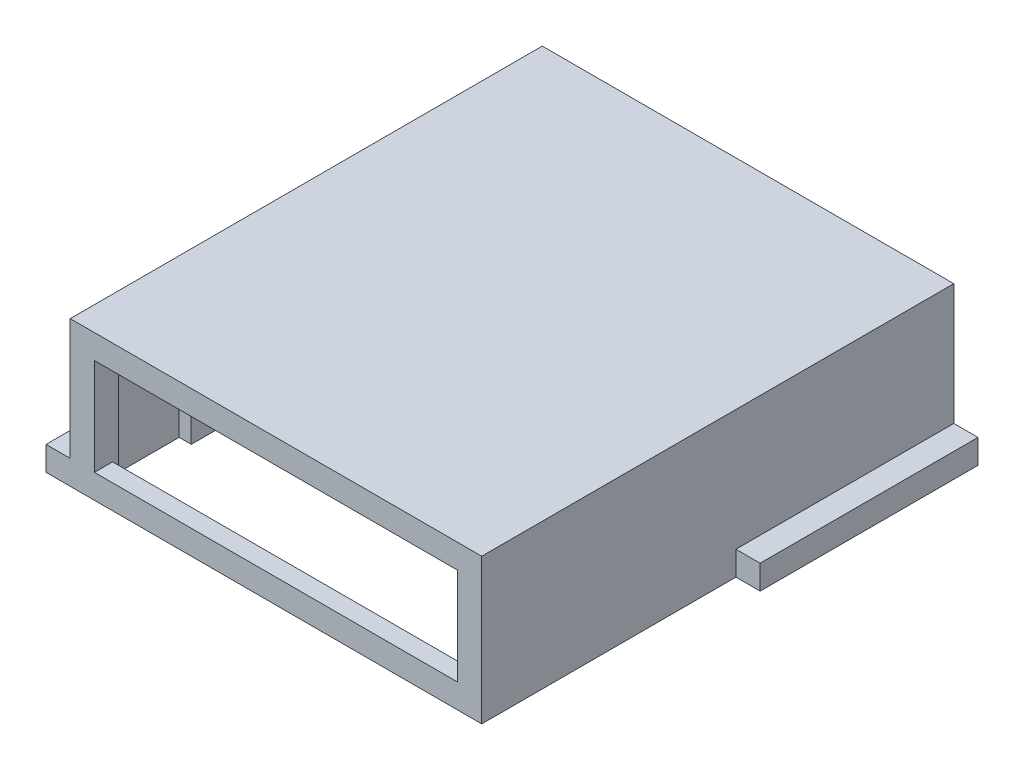
ISO-10303-21;
HEADER;
FILE_DESCRIPTION(('STEP AP214'),'2;1');
FILE_NAME('part.step','',(''),(''),'','','');
FILE_SCHEMA(('AUTOMOTIVE_DESIGN { 1 0 10303 214 1 1 1 1 }'));
ENDSEC;
DATA;
#1=APPLICATION_CONTEXT('core data for automotive mechanical design processes');
#2=APPLICATION_PROTOCOL_DEFINITION('international standard','automotive_design',2000,#1);
#3=PRODUCT_CONTEXT('',#1,'mechanical');
#4=PRODUCT('Part','Part','',(#3));
#5=PRODUCT_RELATED_PRODUCT_CATEGORY('part','',(#4));
#6=PRODUCT_DEFINITION_FORMATION('','',#4);
#7=PRODUCT_DEFINITION_CONTEXT('part definition',#1,'design');
#8=PRODUCT_DEFINITION('design','',#6,#7);
#9=PRODUCT_DEFINITION_SHAPE('','',#8);
#10=(LENGTH_UNIT() NAMED_UNIT(*) SI_UNIT(.MILLI.,.METRE.));
#11=(NAMED_UNIT(*) PLANE_ANGLE_UNIT() SI_UNIT($,.RADIAN.));
#12=(NAMED_UNIT(*) SI_UNIT($,.STERADIAN.) SOLID_ANGLE_UNIT());
#13=UNCERTAINTY_MEASURE_WITH_UNIT(LENGTH_MEASURE(1.E-05),#10,'distance_accuracy_value','');
#14=(GEOMETRIC_REPRESENTATION_CONTEXT(3) GLOBAL_UNCERTAINTY_ASSIGNED_CONTEXT((#13)) GLOBAL_UNIT_ASSIGNED_CONTEXT((#10,
#11,#12)) REPRESENTATION_CONTEXT('',''));
#15=CARTESIAN_POINT('',(0.,0.,0.));
#16=DIRECTION('',(0.,0.,1.));
#17=DIRECTION('',(1.,0.,0.));
#18=AXIS2_PLACEMENT_3D('',#15,#16,#17);
#19=CARTESIAN_POINT('',(0.,0.,0.));
#20=DIRECTION('',(0.,1.,0.));
#21=DIRECTION('',(0.,0.,1.));
#22=AXIS2_PLACEMENT_3D('',#19,#20,#21);
#23=PLANE('',#22);
#24=DIRECTION('',(0.,0.,1.));
#25=VECTOR('',#24,1.);
#26=CARTESIAN_POINT('',(-5.68181818181819,0.,-8.18181818181818));
#27=LINE('',#26,#25);
#28=CARTESIAN_POINT('',(-5.68181818181819,0.,-8.18181818181818));
#29=VERTEX_POINT('',#28);
#30=CARTESIAN_POINT('',(-5.68181818181819,0.,2.31818181818182));
#31=VERTEX_POINT('',#30);
#32=EDGE_CURVE('E436',#29,#31,#27,.T.);
#33=ORIENTED_EDGE('',*,*,#32,.F.);
#34=DIRECTION('',(-1.,0.,0.));
#35=VECTOR('',#34,1.);
#36=CARTESIAN_POINT('',(-5.68181818181819,0.,-8.18181818181818));
#37=LINE('',#36,#35);
#38=CARTESIAN_POINT('',(12.3181818181818,0.,-8.18181818181818));
#39=VERTEX_POINT('',#38);
#40=EDGE_CURVE('E441',#39,#29,#37,.T.);
#41=ORIENTED_EDGE('',*,*,#40,.F.);
#42=DIRECTION('',(0.,0.,-1.));
#43=VECTOR('',#42,1.);
#44=CARTESIAN_POINT('',(12.3181818181818,0.,0.818181818181823));
#45=LINE('',#44,#43);
#46=CARTESIAN_POINT('',(12.3181818181818,0.,0.818181818181823));
#47=VERTEX_POINT('',#46);
#48=EDGE_CURVE('E380',#47,#39,#45,.T.);
#49=ORIENTED_EDGE('',*,*,#48,.F.);
#50=DIRECTION('',(-1.,0.,0.));
#51=VECTOR('',#50,1.);
#52=CARTESIAN_POINT('',(12.3181818181818,0.,0.818181818181823));
#53=LINE('',#52,#51);
#54=CARTESIAN_POINT('',(11.3181818181818,0.,0.818181818181824));
#55=VERTEX_POINT('',#54);
#56=EDGE_CURVE('E398',#47,#55,#53,.T.);
#57=ORIENTED_EDGE('',*,*,#56,.T.);
#58=DIRECTION('',(0.,0.,-1.));
#59=VECTOR('',#58,1.);
#60=CARTESIAN_POINT('',(11.3181818181818,0.,-8.18181818181818));
#61=LINE('',#60,#59);
#62=CARTESIAN_POINT('',(11.3181818181818,0.,11.3181818181818));
#63=VERTEX_POINT('',#62);
#64=EDGE_CURVE('E451',#63,#55,#61,.T.);
#65=ORIENTED_EDGE('',*,*,#64,.F.);
#66=DIRECTION('',(1.,0.,0.));
#67=VECTOR('',#66,1.);
#68=CARTESIAN_POINT('',(-5.68181818181819,0.,11.3181818181818));
#69=LINE('',#68,#67);
#70=CARTESIAN_POINT('',(-6.68181818181819,0.,11.3181818181818));
#71=VERTEX_POINT('',#70);
#72=EDGE_CURVE('E449',#71,#63,#69,.T.);
#73=ORIENTED_EDGE('',*,*,#72,.F.);
#74=DIRECTION('',(0.,0.,1.));
#75=VECTOR('',#74,1.);
#76=CARTESIAN_POINT('',(-6.68181818181819,0.,2.31818181818182));
#77=LINE('',#76,#75);
#78=CARTESIAN_POINT('',(-6.68181818181819,0.,2.31818181818182));
#79=VERTEX_POINT('',#78);
#80=EDGE_CURVE('E355',#79,#71,#77,.T.);
#81=ORIENTED_EDGE('',*,*,#80,.F.);
#82=DIRECTION('',(1.,0.,0.));
#83=VECTOR('',#82,1.);
#84=CARTESIAN_POINT('',(-6.68181818181819,0.,2.31818181818182));
#85=LINE('',#84,#83);
#86=EDGE_CURVE('E373',#79,#31,#85,.T.);
#87=ORIENTED_EDGE('',*,*,#86,.T.);
#88=EDGE_LOOP('',(#33,#41,#49,#57,#65,#73,#81,#87));
#89=FACE_BOUND('',#88,.T.);
#90=DIRECTION('',(1.,0.,0.));
#91=VECTOR('',#90,1.);
#92=CARTESIAN_POINT('',(-5.18181818181819,0.,-3.43181818181818));
#93=LINE('',#92,#91);
#94=CARTESIAN_POINT('',(-5.18181818181819,0.,-3.43181818181818));
#95=VERTEX_POINT('',#94);
#96=CARTESIAN_POINT('',(-4.68181818181819,0.,-3.43181818181818));
#97=VERTEX_POINT('',#96);
#98=EDGE_CURVE('E274',#95,#97,#93,.T.);
#99=ORIENTED_EDGE('',*,*,#98,.T.);
#100=DIRECTION('',(0.,0.,1.));
#101=VECTOR('',#100,1.);
#102=CARTESIAN_POINT('',(-4.68181818181819,0.,-7.43181818181818));
#103=LINE('',#102,#101);
#104=CARTESIAN_POINT('',(-4.68181818181819,0.,7.31818181818182));
#105=VERTEX_POINT('',#104);
#106=EDGE_CURVE('E420',#97,#105,#103,.T.);
#107=ORIENTED_EDGE('',*,*,#106,.T.);
#108=DIRECTION('',(-1.,0.,0.));
#109=VECTOR('',#108,1.);
#110=CARTESIAN_POINT('',(-5.18181818181818,0.,7.31818181818182));
#111=LINE('',#110,#109);
#112=CARTESIAN_POINT('',(-5.18181818181818,0.,7.31818181818182));
#113=VERTEX_POINT('',#112);
#114=EDGE_CURVE('E299',#105,#113,#111,.T.);
#115=ORIENTED_EDGE('',*,*,#114,.T.);
#116=DIRECTION('',(0.,0.,1.));
#117=VECTOR('',#116,1.);
#118=CARTESIAN_POINT('',(-5.18181818181818,0.,10.3181818181818));
#119=LINE('',#118,#117);
#120=CARTESIAN_POINT('',(-5.18181818181818,0.,10.3181818181818));
#121=VERTEX_POINT('',#120);
#122=EDGE_CURVE('E306',#113,#121,#119,.T.);
#123=ORIENTED_EDGE('',*,*,#122,.T.);
#124=DIRECTION('',(1.,0.,0.));
#125=VECTOR('',#124,1.);
#126=CARTESIAN_POINT('',(-5.18181818181818,0.,10.3181818181818));
#127=LINE('',#126,#125);
#128=CARTESIAN_POINT('',(-4.68181818181819,0.,10.3181818181818));
#129=VERTEX_POINT('',#128);
#130=EDGE_CURVE('E303',#121,#129,#127,.T.);
#131=ORIENTED_EDGE('',*,*,#130,.T.);
#132=CARTESIAN_POINT('',(-4.68181818181819,0.,10.5681818181818));
#133=VERTEX_POINT('',#132);
#134=EDGE_CURVE('E418',#129,#133,#103,.T.);
#135=ORIENTED_EDGE('',*,*,#134,.T.);
#136=DIRECTION('',(1.,0.,0.));
#137=VECTOR('',#136,1.);
#138=CARTESIAN_POINT('',(-4.68181818181819,0.,10.5681818181818));
#139=LINE('',#138,#137);
#140=CARTESIAN_POINT('',(10.3181818181818,0.,10.5681818181818));
#141=VERTEX_POINT('',#140);
#142=EDGE_CURVE('E406',#133,#141,#139,.T.);
#143=ORIENTED_EDGE('',*,*,#142,.T.);
#144=DIRECTION('',(0.,0.,-1.));
#145=VECTOR('',#144,1.);
#146=CARTESIAN_POINT('',(10.3181818181818,0.,-7.43181818181818));
#147=LINE('',#146,#145);
#148=CARTESIAN_POINT('',(10.3181818181818,0.,10.3181818181818));
#149=VERTEX_POINT('',#148);
#150=EDGE_CURVE('E413',#141,#149,#147,.T.);
#151=ORIENTED_EDGE('',*,*,#150,.T.);
#152=CARTESIAN_POINT('',(10.8181818181818,0.,10.3181818181818));
#153=VERTEX_POINT('',#152);
#154=EDGE_CURVE('E302',#149,#153,#127,.T.);
#155=ORIENTED_EDGE('',*,*,#154,.T.);
#156=DIRECTION('',(0.,0.,-1.));
#157=VECTOR('',#156,1.);
#158=CARTESIAN_POINT('',(10.8181818181818,0.,10.3181818181818));
#159=LINE('',#158,#157);
#160=CARTESIAN_POINT('',(10.8181818181818,0.,7.31818181818182));
#161=VERTEX_POINT('',#160);
#162=EDGE_CURVE('E298',#153,#161,#159,.T.);
#163=ORIENTED_EDGE('',*,*,#162,.T.);
#164=CARTESIAN_POINT('',(10.3181818181818,0.,7.31818181818182));
#165=VERTEX_POINT('',#164);
#166=EDGE_CURVE('E295',#161,#165,#111,.T.);
#167=ORIENTED_EDGE('',*,*,#166,.T.);
#168=CARTESIAN_POINT('',(10.3181818181818,0.,-3.43181818181818));
#169=VERTEX_POINT('',#168);
#170=EDGE_CURVE('E401',#165,#169,#147,.T.);
#171=ORIENTED_EDGE('',*,*,#170,.T.);
#172=CARTESIAN_POINT('',(10.8181818181818,0.,-3.43181818181818));
#173=VERTEX_POINT('',#172);
#174=EDGE_CURVE('E498',#169,#173,#93,.T.);
#175=ORIENTED_EDGE('',*,*,#174,.T.);
#176=DIRECTION('',(0.,0.,-1.));
#177=VECTOR('',#176,1.);
#178=CARTESIAN_POINT('',(10.8181818181818,0.,-7.43181818181818));
#179=LINE('',#178,#177);
#180=CARTESIAN_POINT('',(10.8181818181818,0.,-7.43181818181818));
#181=VERTEX_POINT('',#180);
#182=EDGE_CURVE('E270',#173,#181,#179,.T.);
#183=ORIENTED_EDGE('',*,*,#182,.T.);
#184=DIRECTION('',(-1.,0.,0.));
#185=VECTOR('',#184,1.);
#186=CARTESIAN_POINT('',(-4.68181818181819,0.,-7.43181818181818));
#187=LINE('',#186,#185);
#188=CARTESIAN_POINT('',(-5.18181818181819,0.,-7.43181818181818));
#189=VERTEX_POINT('',#188);
#190=EDGE_CURVE('E416',#181,#189,#187,.T.);
#191=ORIENTED_EDGE('',*,*,#190,.T.);
#192=DIRECTION('',(0.,0.,1.));
#193=VECTOR('',#192,1.);
#194=CARTESIAN_POINT('',(-5.18181818181819,0.,-7.43181818181818));
#195=LINE('',#194,#193);
#196=EDGE_CURVE('E309',#189,#95,#195,.T.);
#197=ORIENTED_EDGE('',*,*,#196,.T.);
#198=EDGE_LOOP('',(#99,#107,#115,#123,#131,#135,#143,#151,#155,#163,#167,#171,#175,#183,#191,#197));
#199=FACE_BOUND('',#198,.T.);
#200=ADVANCED_FACE('F43',(#89,#199),#23,.F.);
#201=CARTESIAN_POINT('',(10.3181818181818,5.2,-7.43181818181818));
#202=DIRECTION('',(-1.,0.,0.));
#203=DIRECTION('',(0.,0.,1.));
#204=AXIS2_PLACEMENT_3D('',#201,#202,#203);
#205=PLANE('',#204);
#206=DIRECTION('',(0.,0.,-1.));
#207=VECTOR('',#206,1.);
#208=CARTESIAN_POINT('',(10.3181818181818,4.,-7.43181818181818));
#209=LINE('',#208,#207);
#210=CARTESIAN_POINT('',(10.3181818181818,4.,-3.43181818181818));
#211=VERTEX_POINT('',#210);
#212=CARTESIAN_POINT('',(10.3181818181818,4.,-7.43181818181818));
#213=VERTEX_POINT('',#212);
#214=EDGE_CURVE('E326',#211,#213,#209,.T.);
#215=ORIENTED_EDGE('',*,*,#214,.F.);
#216=DIRECTION('',(0.,-1.,0.));
#217=VECTOR('',#216,1.);
#218=CARTESIAN_POINT('',(10.3181818181818,5.2,-3.43181818181818));
#219=LINE('',#218,#217);
#220=EDGE_CURVE('E328',#211,#169,#219,.T.);
#221=ORIENTED_EDGE('',*,*,#220,.T.);
#222=ORIENTED_EDGE('',*,*,#170,.F.);
#223=DIRECTION('',(0.,1.,0.));
#224=VECTOR('',#223,1.);
#225=CARTESIAN_POINT('',(10.3181818181818,5.2,7.31818181818182));
#226=LINE('',#225,#224);
#227=CARTESIAN_POINT('',(10.3181818181818,4.,7.31818181818182));
#228=VERTEX_POINT('',#227);
#229=EDGE_CURVE('E279',#165,#228,#226,.T.);
#230=ORIENTED_EDGE('',*,*,#229,.T.);
#231=DIRECTION('',(0.,0.,1.));
#232=VECTOR('',#231,1.);
#233=CARTESIAN_POINT('',(10.3181818181818,4.,-7.43181818181818));
#234=LINE('',#233,#232);
#235=CARTESIAN_POINT('',(10.3181818181818,4.,10.3181818181818));
#236=VERTEX_POINT('',#235);
#237=EDGE_CURVE('E275',#228,#236,#234,.T.);
#238=ORIENTED_EDGE('',*,*,#237,.T.);
#239=DIRECTION('',(0.,-1.,0.));
#240=VECTOR('',#239,1.);
#241=CARTESIAN_POINT('',(10.3181818181818,5.2,10.3181818181818));
#242=LINE('',#241,#240);
#243=EDGE_CURVE('E323',#236,#149,#242,.T.);
#244=ORIENTED_EDGE('',*,*,#243,.T.);
#245=ORIENTED_EDGE('',*,*,#150,.F.);
#246=DIRECTION('',(0.,-1.,0.));
#247=VECTOR('',#246,1.);
#248=CARTESIAN_POINT('',(10.3181818181818,5.2,10.5681818181818));
#249=LINE('',#248,#247);
#250=CARTESIAN_POINT('',(10.3181818181818,1.,10.5681818181818));
#251=VERTEX_POINT('',#250);
#252=EDGE_CURVE('E412',#251,#141,#249,.T.);
#253=ORIENTED_EDGE('',*,*,#252,.F.);
#254=DIRECTION('',(0.,0.,1.));
#255=VECTOR('',#254,1.);
#256=CARTESIAN_POINT('',(10.3181818181818,1.,-2.68181818181818));
#257=LINE('',#256,#255);
#258=CARTESIAN_POINT('',(10.3181818181818,1.,11.3181818181818));
#259=VERTEX_POINT('',#258);
#260=EDGE_CURVE('E343',#251,#259,#257,.T.);
#261=ORIENTED_EDGE('',*,*,#260,.T.);
#262=DIRECTION('',(0.,1.,0.));
#263=VECTOR('',#262,1.);
#264=CARTESIAN_POINT('',(10.3181818181818,1.,11.3181818181818));
#265=LINE('',#264,#263);
#266=CARTESIAN_POINT('',(10.3181818181818,5.,11.3181818181818));
#267=VERTEX_POINT('',#266);
#268=EDGE_CURVE('E331',#259,#267,#265,.T.);
#269=ORIENTED_EDGE('',*,*,#268,.T.);
#270=DIRECTION('',(0.,0.,1.));
#271=VECTOR('',#270,1.);
#272=CARTESIAN_POINT('',(10.3181818181818,5.,-2.68181818181818));
#273=LINE('',#272,#271);
#274=CARTESIAN_POINT('',(10.3181818181818,5.,10.5681818181818));
#275=VERTEX_POINT('',#274);
#276=EDGE_CURVE('E342',#275,#267,#273,.T.);
#277=ORIENTED_EDGE('',*,*,#276,.F.);
#278=CARTESIAN_POINT('',(10.3181818181818,5.2,10.5681818181818));
#279=VERTEX_POINT('',#278);
#280=EDGE_CURVE('E423',#279,#275,#249,.T.);
#281=ORIENTED_EDGE('',*,*,#280,.F.);
#282=DIRECTION('',(0.,0.,-1.));
#283=VECTOR('',#282,1.);
#284=CARTESIAN_POINT('',(10.3181818181818,5.2,-7.43181818181818));
#285=LINE('',#284,#283);
#286=CARTESIAN_POINT('',(10.3181818181818,5.2,-7.43181818181818));
#287=VERTEX_POINT('',#286);
#288=EDGE_CURVE('E402',#279,#287,#285,.T.);
#289=ORIENTED_EDGE('',*,*,#288,.T.);
#290=DIRECTION('',(0.,-1.,0.));
#291=VECTOR('',#290,1.);
#292=CARTESIAN_POINT('',(10.3181818181818,5.2,-7.43181818181818));
#293=LINE('',#292,#291);
#294=EDGE_CURVE('E433',#287,#213,#293,.T.);
#295=ORIENTED_EDGE('',*,*,#294,.T.);
#296=EDGE_LOOP('',(#215,#221,#222,#230,#238,#244,#245,#253,#261,#269,#277,#281,#289,#295));
#297=FACE_BOUND('',#296,.T.);
#298=ADVANCED_FACE('F522',(#297),#205,.T.);
#299=CARTESIAN_POINT('',(-4.68181818181819,5.2,-7.43181818181818));
#300=DIRECTION('',(1.,0.,0.));
#301=DIRECTION('',(0.,0.,-1.));
#302=AXIS2_PLACEMENT_3D('',#299,#300,#301);
#303=PLANE('',#302);
#304=ORIENTED_EDGE('',*,*,#106,.F.);
#305=DIRECTION('',(0.,1.,0.));
#306=VECTOR('',#305,1.);
#307=CARTESIAN_POINT('',(-4.68181818181819,5.2,-3.43181818181818));
#308=LINE('',#307,#306);
#309=CARTESIAN_POINT('',(-4.68181818181819,4.,-3.43181818181818));
#310=VERTEX_POINT('',#309);
#311=EDGE_CURVE('E11',#97,#310,#308,.T.);
#312=ORIENTED_EDGE('',*,*,#311,.T.);
#313=DIRECTION('',(0.,0.,1.));
#314=VECTOR('',#313,1.);
#315=CARTESIAN_POINT('',(-4.68181818181819,4.,-7.43181818181818));
#316=LINE('',#315,#314);
#317=CARTESIAN_POINT('',(-4.68181818181819,4.,-7.43181818181818));
#318=VERTEX_POINT('',#317);
#319=EDGE_CURVE('E51',#318,#310,#316,.T.);
#320=ORIENTED_EDGE('',*,*,#319,.F.);
#321=DIRECTION('',(0.,-1.,0.));
#322=VECTOR('',#321,1.);
#323=CARTESIAN_POINT('',(-4.68181818181819,5.2,-7.43181818181818));
#324=LINE('',#323,#322);
#325=CARTESIAN_POINT('',(-4.68181818181819,5.2,-7.43181818181818));
#326=VERTEX_POINT('',#325);
#327=EDGE_CURVE('E430',#326,#318,#324,.T.);
#328=ORIENTED_EDGE('',*,*,#327,.F.);
#329=DIRECTION('',(0.,0.,1.));
#330=VECTOR('',#329,1.);
#331=CARTESIAN_POINT('',(-4.68181818181819,5.2,-7.43181818181818));
#332=LINE('',#331,#330);
#333=CARTESIAN_POINT('',(-4.68181818181819,5.2,10.5681818181818));
#334=VERTEX_POINT('',#333);
#335=EDGE_CURVE('E408',#326,#334,#332,.T.);
#336=ORIENTED_EDGE('',*,*,#335,.T.);
#337=DIRECTION('',(0.,-1.,0.));
#338=VECTOR('',#337,1.);
#339=CARTESIAN_POINT('',(-4.68181818181819,5.2,10.5681818181818));
#340=LINE('',#339,#338);
#341=CARTESIAN_POINT('',(-4.68181818181819,5.,10.5681818181818));
#342=VERTEX_POINT('',#341);
#343=EDGE_CURVE('E427',#334,#342,#340,.T.);
#344=ORIENTED_EDGE('',*,*,#343,.T.);
#345=DIRECTION('',(0.,0.,1.));
#346=VECTOR('',#345,1.);
#347=CARTESIAN_POINT('',(-4.68181818181819,5.,-2.68181818181818));
#348=LINE('',#347,#346);
#349=CARTESIAN_POINT('',(-4.68181818181819,5.,11.3181818181818));
#350=VERTEX_POINT('',#349);
#351=EDGE_CURVE('E348',#342,#350,#348,.T.);
#352=ORIENTED_EDGE('',*,*,#351,.T.);
#353=DIRECTION('',(0.,-1.,0.));
#354=VECTOR('',#353,1.);
#355=CARTESIAN_POINT('',(-4.68181818181819,1.,11.3181818181818));
#356=LINE('',#355,#354);
#357=CARTESIAN_POINT('',(-4.68181818181819,1.,11.3181818181818));
#358=VERTEX_POINT('',#357);
#359=EDGE_CURVE('E336',#350,#358,#356,.T.);
#360=ORIENTED_EDGE('',*,*,#359,.T.);
#361=DIRECTION('',(0.,0.,1.));
#362=VECTOR('',#361,1.);
#363=CARTESIAN_POINT('',(-4.68181818181819,1.,-2.68181818181818));
#364=LINE('',#363,#362);
#365=CARTESIAN_POINT('',(-4.68181818181819,1.,10.5681818181818));
#366=VERTEX_POINT('',#365);
#367=EDGE_CURVE('E346',#366,#358,#364,.T.);
#368=ORIENTED_EDGE('',*,*,#367,.F.);
#369=EDGE_CURVE('E426',#366,#133,#340,.T.);
#370=ORIENTED_EDGE('',*,*,#369,.T.);
#371=ORIENTED_EDGE('',*,*,#134,.F.);
#372=DIRECTION('',(0.,1.,0.));
#373=VECTOR('',#372,1.);
#374=CARTESIAN_POINT('',(-4.68181818181819,5.2,10.3181818181818));
#375=LINE('',#374,#373);
#376=CARTESIAN_POINT('',(-4.68181818181819,4.,10.3181818181818));
#377=VERTEX_POINT('',#376);
#378=EDGE_CURVE('E475',#129,#377,#375,.T.);
#379=ORIENTED_EDGE('',*,*,#378,.T.);
#380=DIRECTION('',(0.,0.,-1.));
#381=VECTOR('',#380,1.);
#382=CARTESIAN_POINT('',(-4.68181818181819,4.,-7.43181818181818));
#383=LINE('',#382,#381);
#384=CARTESIAN_POINT('',(-4.68181818181819,4.,7.31818181818182));
#385=VERTEX_POINT('',#384);
#386=EDGE_CURVE('E469',#377,#385,#383,.T.);
#387=ORIENTED_EDGE('',*,*,#386,.T.);
#388=DIRECTION('',(0.,-1.,0.));
#389=VECTOR('',#388,1.);
#390=CARTESIAN_POINT('',(-4.68181818181819,5.2,7.31818181818182));
#391=LINE('',#390,#389);
#392=EDGE_CURVE('E472',#385,#105,#391,.T.);
#393=ORIENTED_EDGE('',*,*,#392,.T.);
#394=EDGE_LOOP('',(#304,#312,#320,#328,#336,#344,#352,#360,#368,#370,#371,#379,#387,#393));
#395=FACE_BOUND('',#394,.T.);
#396=ADVANCED_FACE('F480',(#395),#303,.T.);
#397=CARTESIAN_POINT('',(-4.68181818181819,5.2,10.5681818181818));
#398=DIRECTION('',(0.,0.,-1.));
#399=DIRECTION('',(-1.,0.,0.));
#400=AXIS2_PLACEMENT_3D('',#397,#398,#399);
#401=PLANE('',#400);
#402=DIRECTION('',(-1.,0.,0.));
#403=VECTOR('',#402,1.);
#404=CARTESIAN_POINT('',(-4.68181818181819,1.,10.5681818181818));
#405=LINE('',#404,#403);
#406=EDGE_CURVE('E467',#251,#366,#405,.T.);
#407=ORIENTED_EDGE('',*,*,#406,.F.);
#408=ORIENTED_EDGE('',*,*,#252,.T.);
#409=ORIENTED_EDGE('',*,*,#142,.F.);
#410=ORIENTED_EDGE('',*,*,#369,.F.);
#411=EDGE_LOOP('',(#407,#408,#409,#410));
#412=FACE_BOUND('',#411,.T.);
#413=ADVANCED_FACE('F555',(#412),#401,.T.);
#414=CARTESIAN_POINT('',(-5.68181818181819,6.,-8.18181818181818));
#415=DIRECTION('',(1.,0.,0.));
#416=DIRECTION('',(0.,0.,-1.));
#417=AXIS2_PLACEMENT_3D('',#414,#415,#416);
#418=PLANE('',#417);
#419=DIRECTION('',(0.,-1.,0.));
#420=VECTOR('',#419,1.);
#421=CARTESIAN_POINT('',(-5.68181818181819,0.,2.31818181818182));
#422=LINE('',#421,#420);
#423=CARTESIAN_POINT('',(-5.68181818181819,1.,2.31818181818182));
#424=VERTEX_POINT('',#423);
#425=EDGE_CURVE('E345',#424,#31,#422,.T.);
#426=ORIENTED_EDGE('',*,*,#425,.F.);
#427=DIRECTION('',(0.,0.,-1.));
#428=VECTOR('',#427,1.);
#429=CARTESIAN_POINT('',(-5.68181818181819,1.,2.31818181818182));
#430=LINE('',#429,#428);
#431=CARTESIAN_POINT('',(-5.68181818181819,1.,11.3181818181818));
#432=VERTEX_POINT('',#431);
#433=EDGE_CURVE('E356',#432,#424,#430,.T.);
#434=ORIENTED_EDGE('',*,*,#433,.F.);
#435=DIRECTION('',(0.,-1.,0.));
#436=VECTOR('',#435,1.);
#437=CARTESIAN_POINT('',(-5.68181818181819,6.,11.3181818181818));
#438=LINE('',#437,#436);
#439=CARTESIAN_POINT('',(-5.68181818181819,6.,11.3181818181818));
#440=VERTEX_POINT('',#439);
#441=EDGE_CURVE('E462',#440,#432,#438,.T.);
#442=ORIENTED_EDGE('',*,*,#441,.F.);
#443=DIRECTION('',(0.,0.,1.));
#444=VECTOR('',#443,1.);
#445=CARTESIAN_POINT('',(-5.68181818181819,6.,-8.18181818181818));
#446=LINE('',#445,#444);
#447=CARTESIAN_POINT('',(-5.68181818181819,6.,-8.18181818181818));
#448=VERTEX_POINT('',#447);
#449=EDGE_CURVE('E437',#448,#440,#446,.T.);
#450=ORIENTED_EDGE('',*,*,#449,.F.);
#451=DIRECTION('',(0.,-1.,0.));
#452=VECTOR('',#451,1.);
#453=CARTESIAN_POINT('',(-5.68181818181819,6.,-8.18181818181818));
#454=LINE('',#453,#452);
#455=EDGE_CURVE('E447',#448,#29,#454,.T.);
#456=ORIENTED_EDGE('',*,*,#455,.T.);
#457=ORIENTED_EDGE('',*,*,#32,.T.);
#458=EDGE_LOOP('',(#426,#434,#442,#450,#456,#457));
#459=FACE_BOUND('',#458,.T.);
#460=ADVANCED_FACE('F45',(#459),#418,.F.);
#461=CARTESIAN_POINT('',(11.3181818181818,6.,-8.18181818181818));
#462=DIRECTION('',(-1.,0.,0.));
#463=DIRECTION('',(0.,0.,1.));
#464=AXIS2_PLACEMENT_3D('',#461,#462,#463);
#465=PLANE('',#464);
#466=DIRECTION('',(0.,-1.,0.));
#467=VECTOR('',#466,1.);
#468=CARTESIAN_POINT('',(11.3181818181818,0.,0.818181818181823));
#469=LINE('',#468,#467);
#470=CARTESIAN_POINT('',(11.3181818181818,1.,0.818181818181823));
#471=VERTEX_POINT('',#470);
#472=EDGE_CURVE('E376',#471,#55,#469,.T.);
#473=ORIENTED_EDGE('',*,*,#472,.F.);
#474=DIRECTION('',(0.,0.,1.));
#475=VECTOR('',#474,1.);
#476=CARTESIAN_POINT('',(11.3181818181818,1.,0.818181818181823));
#477=LINE('',#476,#475);
#478=CARTESIAN_POINT('',(11.3181818181818,1.,-8.18181818181818));
#479=VERTEX_POINT('',#478);
#480=EDGE_CURVE('E381',#479,#471,#477,.T.);
#481=ORIENTED_EDGE('',*,*,#480,.F.);
#482=DIRECTION('',(0.,-1.,0.));
#483=VECTOR('',#482,1.);
#484=CARTESIAN_POINT('',(11.3181818181818,6.,-8.18181818181818));
#485=LINE('',#484,#483);
#486=CARTESIAN_POINT('',(11.3181818181818,6.,-8.18181818181818));
#487=VERTEX_POINT('',#486);
#488=EDGE_CURVE('E456',#487,#479,#485,.T.);
#489=ORIENTED_EDGE('',*,*,#488,.F.);
#490=DIRECTION('',(0.,0.,-1.));
#491=VECTOR('',#490,1.);
#492=CARTESIAN_POINT('',(11.3181818181818,6.,-8.18181818181818));
#493=LINE('',#492,#491);
#494=CARTESIAN_POINT('',(11.3181818181818,6.,11.3181818181818));
#495=VERTEX_POINT('',#494);
#496=EDGE_CURVE('E443',#495,#487,#493,.T.);
#497=ORIENTED_EDGE('',*,*,#496,.F.);
#498=DIRECTION('',(0.,-1.,0.));
#499=VECTOR('',#498,1.);
#500=CARTESIAN_POINT('',(11.3181818181818,6.,11.3181818181818));
#501=LINE('',#500,#499);
#502=EDGE_CURVE('E459',#495,#63,#501,.T.);
#503=ORIENTED_EDGE('',*,*,#502,.T.);
#504=ORIENTED_EDGE('',*,*,#64,.T.);
#505=EDGE_LOOP('',(#473,#481,#489,#497,#503,#504));
#506=FACE_BOUND('',#505,.T.);
#507=ADVANCED_FACE('F597',(#506),#465,.F.);
#508=CARTESIAN_POINT('',(-5.68181818181819,6.,11.3181818181818));
#509=DIRECTION('',(0.,0.,-1.));
#510=DIRECTION('',(-1.,0.,0.));
#511=AXIS2_PLACEMENT_3D('',#508,#509,#510);
#512=PLANE('',#511);
#513=DIRECTION('',(-1.,0.,0.));
#514=VECTOR('',#513,1.);
#515=CARTESIAN_POINT('',(-4.68181818181819,5.,11.3181818181818));
#516=LINE('',#515,#514);
#517=EDGE_CURVE('E333',#267,#350,#516,.T.);
#518=ORIENTED_EDGE('',*,*,#517,.F.);
#519=ORIENTED_EDGE('',*,*,#268,.F.);
#520=DIRECTION('',(1.,0.,0.));
#521=VECTOR('',#520,1.);
#522=CARTESIAN_POINT('',(-4.68181818181819,1.,11.3181818181818));
#523=LINE('',#522,#521);
#524=EDGE_CURVE('E339',#358,#259,#523,.T.);
#525=ORIENTED_EDGE('',*,*,#524,.F.);
#526=ORIENTED_EDGE('',*,*,#359,.F.);
#527=EDGE_LOOP('',(#518,#519,#525,#526));
#528=FACE_BOUND('',#527,.T.);
#529=ORIENTED_EDGE('',*,*,#72,.T.);
#530=ORIENTED_EDGE('',*,*,#502,.F.);
#531=DIRECTION('',(1.,0.,0.));
#532=VECTOR('',#531,1.);
#533=CARTESIAN_POINT('',(-5.68181818181819,6.,11.3181818181818));
#534=LINE('',#533,#532);
#535=EDGE_CURVE('E440',#440,#495,#534,.T.);
#536=ORIENTED_EDGE('',*,*,#535,.F.);
#537=ORIENTED_EDGE('',*,*,#441,.T.);
#538=DIRECTION('',(1.,0.,0.));
#539=VECTOR('',#538,1.);
#540=CARTESIAN_POINT('',(-6.68181818181819,1.,11.3181818181818));
#541=LINE('',#540,#539);
#542=CARTESIAN_POINT('',(-6.68181818181819,1.,11.3181818181818));
#543=VERTEX_POINT('',#542);
#544=EDGE_CURVE('E370',#543,#432,#541,.T.);
#545=ORIENTED_EDGE('',*,*,#544,.F.);
#546=DIRECTION('',(0.,1.,0.));
#547=VECTOR('',#546,1.);
#548=CARTESIAN_POINT('',(-6.68181818181819,0.,11.3181818181818));
#549=LINE('',#548,#547);
#550=EDGE_CURVE('E359',#71,#543,#549,.T.);
#551=ORIENTED_EDGE('',*,*,#550,.F.);
#552=EDGE_LOOP('',(#529,#530,#536,#537,#545,#551));
#553=FACE_BOUND('',#552,.T.);
#554=ADVANCED_FACE('F546',(#528,#553),#512,.F.);
#555=CARTESIAN_POINT('',(-5.68181818181819,6.,-8.18181818181818));
#556=DIRECTION('',(0.,0.,1.));
#557=DIRECTION('',(1.,0.,0.));
#558=AXIS2_PLACEMENT_3D('',#555,#556,#557);
#559=PLANE('',#558);
#560=ORIENTED_EDGE('',*,*,#40,.T.);
#561=ORIENTED_EDGE('',*,*,#455,.F.);
#562=DIRECTION('',(-1.,0.,0.));
#563=VECTOR('',#562,1.);
#564=CARTESIAN_POINT('',(-5.68181818181819,6.,-8.18181818181818));
#565=LINE('',#564,#563);
#566=EDGE_CURVE('E445',#487,#448,#565,.T.);
#567=ORIENTED_EDGE('',*,*,#566,.F.);
#568=ORIENTED_EDGE('',*,*,#488,.T.);
#569=DIRECTION('',(-1.,0.,0.));
#570=VECTOR('',#569,1.);
#571=CARTESIAN_POINT('',(12.3181818181818,1.,-8.18181818181818));
#572=LINE('',#571,#570);
#573=CARTESIAN_POINT('',(12.3181818181818,1.,-8.18181818181818));
#574=VERTEX_POINT('',#573);
#575=EDGE_CURVE('E395',#574,#479,#572,.T.);
#576=ORIENTED_EDGE('',*,*,#575,.F.);
#577=DIRECTION('',(0.,1.,0.));
#578=VECTOR('',#577,1.);
#579=CARTESIAN_POINT('',(12.3181818181818,0.,-8.18181818181818));
#580=LINE('',#579,#578);
#581=EDGE_CURVE('E384',#39,#574,#580,.T.);
#582=ORIENTED_EDGE('',*,*,#581,.F.);
#583=EDGE_LOOP('',(#560,#561,#567,#568,#576,#582));
#584=FACE_BOUND('',#583,.T.);
#585=ADVANCED_FACE('F593',(#584),#559,.F.);
#586=CARTESIAN_POINT('',(0.,6.,0.));
#587=DIRECTION('',(0.,1.,0.));
#588=DIRECTION('',(0.,0.,1.));
#589=AXIS2_PLACEMENT_3D('',#586,#587,#588);
#590=PLANE('',#589);
#591=ORIENTED_EDGE('',*,*,#449,.T.);
#592=ORIENTED_EDGE('',*,*,#535,.T.);
#593=ORIENTED_EDGE('',*,*,#496,.T.);
#594=ORIENTED_EDGE('',*,*,#566,.T.);
#595=EDGE_LOOP('',(#591,#592,#593,#594));
#596=FACE_BOUND('',#595,.T.);
#597=ADVANCED_FACE('F592',(#596),#590,.T.);
#598=CARTESIAN_POINT('',(-4.68181818181819,5.2,-7.43181818181818));
#599=DIRECTION('',(0.,0.,1.));
#600=DIRECTION('',(1.,0.,0.));
#601=AXIS2_PLACEMENT_3D('',#598,#599,#600);
#602=PLANE('',#601);
#603=ORIENTED_EDGE('',*,*,#327,.T.);
#604=DIRECTION('',(-1.,0.,0.));
#605=VECTOR('',#604,1.);
#606=CARTESIAN_POINT('',(-5.18181818181819,4.,-7.43181818181818));
#607=LINE('',#606,#605);
#608=CARTESIAN_POINT('',(-5.18181818181819,4.,-7.43181818181818));
#609=VERTEX_POINT('',#608);
#610=EDGE_CURVE('E526',#318,#609,#607,.T.);
#611=ORIENTED_EDGE('',*,*,#610,.T.);
#612=DIRECTION('',(0.,-1.,0.));
#613=VECTOR('',#612,1.);
#614=CARTESIAN_POINT('',(-5.18181818181819,4.,-7.43181818181818));
#615=LINE('',#614,#613);
#616=EDGE_CURVE('E269',#609,#189,#615,.T.);
#617=ORIENTED_EDGE('',*,*,#616,.T.);
#618=ORIENTED_EDGE('',*,*,#190,.F.);
#619=DIRECTION('',(0.,-1.,0.));
#620=VECTOR('',#619,1.);
#621=CARTESIAN_POINT('',(10.8181818181818,4.,-7.43181818181818));
#622=LINE('',#621,#620);
#623=CARTESIAN_POINT('',(10.8181818181818,4.,-7.43181818181818));
#624=VERTEX_POINT('',#623);
#625=EDGE_CURVE('E281',#624,#181,#622,.T.);
#626=ORIENTED_EDGE('',*,*,#625,.F.);
#627=EDGE_CURVE('E506',#624,#213,#607,.T.);
#628=ORIENTED_EDGE('',*,*,#627,.T.);
#629=ORIENTED_EDGE('',*,*,#294,.F.);
#630=DIRECTION('',(-1.,0.,0.));
#631=VECTOR('',#630,1.);
#632=CARTESIAN_POINT('',(-4.68181818181819,5.2,-7.43181818181818));
#633=LINE('',#632,#631);
#634=EDGE_CURVE('E405',#287,#326,#633,.T.);
#635=ORIENTED_EDGE('',*,*,#634,.T.);
#636=EDGE_LOOP('',(#603,#611,#617,#618,#626,#628,#629,#635));
#637=FACE_BOUND('',#636,.T.);
#638=ADVANCED_FACE('F525',(#637),#602,.T.);
#639=DIRECTION('',(1.,0.,0.));
#640=VECTOR('',#639,1.);
#641=CARTESIAN_POINT('',(-4.68181818181819,5.,10.5681818181818));
#642=LINE('',#641,#640);
#643=EDGE_CURVE('E465',#342,#275,#642,.T.);
#644=ORIENTED_EDGE('',*,*,#643,.F.);
#645=ORIENTED_EDGE('',*,*,#343,.F.);
#646=DIRECTION('',(1.,0.,0.));
#647=VECTOR('',#646,1.);
#648=CARTESIAN_POINT('',(-4.68181818181819,5.2,10.5681818181818));
#649=LINE('',#648,#647);
#650=EDGE_CURVE('E410',#334,#279,#649,.T.);
#651=ORIENTED_EDGE('',*,*,#650,.T.);
#652=ORIENTED_EDGE('',*,*,#280,.T.);
#653=EDGE_LOOP('',(#644,#645,#651,#652));
#654=FACE_BOUND('',#653,.T.);
#655=ADVANCED_FACE('F538',(#654),#401,.T.);
#656=CARTESIAN_POINT('',(0.,5.2,0.));
#657=DIRECTION('',(0.,1.,0.));
#658=DIRECTION('',(0.,0.,1.));
#659=AXIS2_PLACEMENT_3D('',#656,#657,#658);
#660=PLANE('',#659);
#661=ORIENTED_EDGE('',*,*,#288,.F.);
#662=ORIENTED_EDGE('',*,*,#650,.F.);
#663=ORIENTED_EDGE('',*,*,#335,.F.);
#664=ORIENTED_EDGE('',*,*,#634,.F.);
#665=EDGE_LOOP('',(#661,#662,#663,#664));
#666=FACE_BOUND('',#665,.T.);
#667=ADVANCED_FACE('F534',(#666),#660,.F.);
#668=CARTESIAN_POINT('',(12.3181818181818,0.,0.818181818181823));
#669=DIRECTION('',(0.,0.,-1.));
#670=DIRECTION('',(-1.,0.,0.));
#671=AXIS2_PLACEMENT_3D('',#668,#669,#670);
#672=PLANE('',#671);
#673=ORIENTED_EDGE('',*,*,#472,.T.);
#674=ORIENTED_EDGE('',*,*,#56,.F.);
#675=DIRECTION('',(0.,-1.,0.));
#676=VECTOR('',#675,1.);
#677=CARTESIAN_POINT('',(12.3181818181818,0.,0.818181818181823));
#678=LINE('',#677,#676);
#679=CARTESIAN_POINT('',(12.3181818181818,1.,0.818181818181823));
#680=VERTEX_POINT('',#679);
#681=EDGE_CURVE('E377',#680,#47,#678,.T.);
#682=ORIENTED_EDGE('',*,*,#681,.F.);
#683=DIRECTION('',(-1.,0.,0.));
#684=VECTOR('',#683,1.);
#685=CARTESIAN_POINT('',(12.3181818181818,1.,0.818181818181823));
#686=LINE('',#685,#684);
#687=EDGE_CURVE('E388',#680,#471,#686,.T.);
#688=ORIENTED_EDGE('',*,*,#687,.T.);
#689=EDGE_LOOP('',(#673,#674,#682,#688));
#690=FACE_BOUND('',#689,.T.);
#691=ADVANCED_FACE('F803',(#690),#672,.F.);
#692=CARTESIAN_POINT('',(12.3181818181818,1.,0.818181818181823));
#693=DIRECTION('',(0.,-1.,0.));
#694=DIRECTION('',(0.,0.,-1.));
#695=AXIS2_PLACEMENT_3D('',#692,#693,#694);
#696=PLANE('',#695);
#697=ORIENTED_EDGE('',*,*,#480,.T.);
#698=ORIENTED_EDGE('',*,*,#687,.F.);
#699=DIRECTION('',(0.,0.,1.));
#700=VECTOR('',#699,1.);
#701=CARTESIAN_POINT('',(12.3181818181818,1.,0.818181818181823));
#702=LINE('',#701,#700);
#703=EDGE_CURVE('E386',#574,#680,#702,.T.);
#704=ORIENTED_EDGE('',*,*,#703,.F.);
#705=ORIENTED_EDGE('',*,*,#575,.T.);
#706=EDGE_LOOP('',(#697,#698,#704,#705));
#707=FACE_BOUND('',#706,.T.);
#708=ADVANCED_FACE('F808',(#707),#696,.F.);
#709=CARTESIAN_POINT('',(12.3181818181818,0.,0.));
#710=DIRECTION('',(-1.,0.,0.));
#711=DIRECTION('',(0.,0.,1.));
#712=AXIS2_PLACEMENT_3D('',#709,#710,#711);
#713=PLANE('',#712);
#714=ORIENTED_EDGE('',*,*,#681,.T.);
#715=ORIENTED_EDGE('',*,*,#48,.T.);
#716=ORIENTED_EDGE('',*,*,#581,.T.);
#717=ORIENTED_EDGE('',*,*,#703,.T.);
#718=EDGE_LOOP('',(#714,#715,#716,#717));
#719=FACE_BOUND('',#718,.T.);
#720=ADVANCED_FACE('F818',(#719),#713,.F.);
#721=CARTESIAN_POINT('',(-6.68181818181819,0.,2.31818181818182));
#722=DIRECTION('',(0.,0.,1.));
#723=DIRECTION('',(1.,0.,0.));
#724=AXIS2_PLACEMENT_3D('',#721,#722,#723);
#725=PLANE('',#724);
#726=ORIENTED_EDGE('',*,*,#425,.T.);
#727=ORIENTED_EDGE('',*,*,#86,.F.);
#728=DIRECTION('',(0.,-1.,0.));
#729=VECTOR('',#728,1.);
#730=CARTESIAN_POINT('',(-6.68181818181819,0.,2.31818181818182));
#731=LINE('',#730,#729);
#732=CARTESIAN_POINT('',(-6.68181818181819,1.,2.31818181818182));
#733=VERTEX_POINT('',#732);
#734=EDGE_CURVE('E352',#733,#79,#731,.T.);
#735=ORIENTED_EDGE('',*,*,#734,.F.);
#736=DIRECTION('',(1.,0.,0.));
#737=VECTOR('',#736,1.);
#738=CARTESIAN_POINT('',(-6.68181818181819,1.,2.31818181818182));
#739=LINE('',#738,#737);
#740=EDGE_CURVE('E363',#733,#424,#739,.T.);
#741=ORIENTED_EDGE('',*,*,#740,.T.);
#742=EDGE_LOOP('',(#726,#727,#735,#741));
#743=FACE_BOUND('',#742,.T.);
#744=ADVANCED_FACE('F827',(#743),#725,.F.);
#745=CARTESIAN_POINT('',(-6.68181818181819,1.,2.31818181818182));
#746=DIRECTION('',(0.,-1.,0.));
#747=DIRECTION('',(0.,0.,-1.));
#748=AXIS2_PLACEMENT_3D('',#745,#746,#747);
#749=PLANE('',#748);
#750=ORIENTED_EDGE('',*,*,#433,.T.);
#751=ORIENTED_EDGE('',*,*,#740,.F.);
#752=DIRECTION('',(0.,0.,-1.));
#753=VECTOR('',#752,1.);
#754=CARTESIAN_POINT('',(-6.68181818181819,1.,2.31818181818182));
#755=LINE('',#754,#753);
#756=EDGE_CURVE('E361',#543,#733,#755,.T.);
#757=ORIENTED_EDGE('',*,*,#756,.F.);
#758=ORIENTED_EDGE('',*,*,#544,.T.);
#759=EDGE_LOOP('',(#750,#751,#757,#758));
#760=FACE_BOUND('',#759,.T.);
#761=ADVANCED_FACE('F843',(#760),#749,.F.);
#762=CARTESIAN_POINT('',(-6.68181818181819,0.,0.));
#763=DIRECTION('',(1.,0.,0.));
#764=DIRECTION('',(0.,0.,-1.));
#765=AXIS2_PLACEMENT_3D('',#762,#763,#764);
#766=PLANE('',#765);
#767=ORIENTED_EDGE('',*,*,#734,.T.);
#768=ORIENTED_EDGE('',*,*,#80,.T.);
#769=ORIENTED_EDGE('',*,*,#550,.T.);
#770=ORIENTED_EDGE('',*,*,#756,.T.);
#771=EDGE_LOOP('',(#767,#768,#769,#770));
#772=FACE_BOUND('',#771,.T.);
#773=ADVANCED_FACE('F625',(#772),#766,.F.);
#774=CARTESIAN_POINT('',(-4.68181818181819,1.,-2.68181818181818));
#775=DIRECTION('',(0.,-1.,0.));
#776=DIRECTION('',(0.,0.,-1.));
#777=AXIS2_PLACEMENT_3D('',#774,#775,#776);
#778=PLANE('',#777);
#779=ORIENTED_EDGE('',*,*,#406,.T.);
#780=ORIENTED_EDGE('',*,*,#367,.T.);
#781=ORIENTED_EDGE('',*,*,#524,.T.);
#782=ORIENTED_EDGE('',*,*,#260,.F.);
#783=EDGE_LOOP('',(#779,#780,#781,#782));
#784=FACE_BOUND('',#783,.T.);
#785=ADVANCED_FACE('F622',(#784),#778,.F.);
#786=CARTESIAN_POINT('',(-4.68181818181819,5.,-2.68181818181818));
#787=DIRECTION('',(0.,1.,0.));
#788=DIRECTION('',(0.,0.,1.));
#789=AXIS2_PLACEMENT_3D('',#786,#787,#788);
#790=PLANE('',#789);
#791=ORIENTED_EDGE('',*,*,#643,.T.);
#792=ORIENTED_EDGE('',*,*,#276,.T.);
#793=ORIENTED_EDGE('',*,*,#517,.T.);
#794=ORIENTED_EDGE('',*,*,#351,.F.);
#795=EDGE_LOOP('',(#791,#792,#793,#794));
#796=FACE_BOUND('',#795,.T.);
#797=ADVANCED_FACE('F543',(#796),#790,.F.);
#798=CARTESIAN_POINT('',(0.,4.,0.));
#799=DIRECTION('',(0.,-1.,0.));
#800=DIRECTION('',(0.,0.,-1.));
#801=AXIS2_PLACEMENT_3D('',#798,#799,#800);
#802=PLANE('',#801);
#803=DIRECTION('',(1.,0.,0.));
#804=VECTOR('',#803,1.);
#805=CARTESIAN_POINT('',(-5.18181818181818,4.,10.3181818181818));
#806=LINE('',#805,#804);
#807=CARTESIAN_POINT('',(-5.18181818181818,4.,10.3181818181818));
#808=VERTEX_POINT('',#807);
#809=EDGE_CURVE('E315',#808,#377,#806,.T.);
#810=ORIENTED_EDGE('',*,*,#809,.F.);
#811=DIRECTION('',(0.,0.,1.));
#812=VECTOR('',#811,1.);
#813=CARTESIAN_POINT('',(-5.18181818181818,4.,10.3181818181818));
#814=LINE('',#813,#812);
#815=CARTESIAN_POINT('',(-5.18181818181818,4.,7.31818181818182));
#816=VERTEX_POINT('',#815);
#817=EDGE_CURVE('E318',#816,#808,#814,.T.);
#818=ORIENTED_EDGE('',*,*,#817,.F.);
#819=DIRECTION('',(-1.,0.,0.));
#820=VECTOR('',#819,1.);
#821=CARTESIAN_POINT('',(-5.18181818181818,4.,7.31818181818182));
#822=LINE('',#821,#820);
#823=EDGE_CURVE('E294',#385,#816,#822,.T.);
#824=ORIENTED_EDGE('',*,*,#823,.F.);
#825=ORIENTED_EDGE('',*,*,#386,.F.);
#826=EDGE_LOOP('',(#810,#818,#824,#825));
#827=FACE_BOUND('',#826,.T.);
#828=ADVANCED_FACE('F494',(#827),#802,.T.);
#829=CARTESIAN_POINT('',(-5.18181818181818,4.,7.31818181818182));
#830=DIRECTION('',(0.,0.,1.));
#831=DIRECTION('',(1.,0.,0.));
#832=AXIS2_PLACEMENT_3D('',#829,#830,#831);
#833=PLANE('',#832);
#834=ORIENTED_EDGE('',*,*,#823,.T.);
#835=DIRECTION('',(0.,-1.,0.));
#836=VECTOR('',#835,1.);
#837=CARTESIAN_POINT('',(-5.18181818181818,4.,7.31818181818182));
#838=LINE('',#837,#836);
#839=EDGE_CURVE('E292',#816,#113,#838,.T.);
#840=ORIENTED_EDGE('',*,*,#839,.T.);
#841=ORIENTED_EDGE('',*,*,#114,.F.);
#842=ORIENTED_EDGE('',*,*,#392,.F.);
#843=EDGE_LOOP('',(#834,#840,#841,#842));
#844=FACE_BOUND('',#843,.T.);
#845=ADVANCED_FACE('F497',(#844),#833,.T.);
#846=CARTESIAN_POINT('',(-5.18181818181818,4.,10.3181818181818));
#847=DIRECTION('',(0.,0.,-1.));
#848=DIRECTION('',(-1.,0.,0.));
#849=AXIS2_PLACEMENT_3D('',#846,#847,#848);
#850=PLANE('',#849);
#851=ORIENTED_EDGE('',*,*,#130,.F.);
#852=DIRECTION('',(0.,-1.,0.));
#853=VECTOR('',#852,1.);
#854=CARTESIAN_POINT('',(-5.18181818181818,4.,10.3181818181818));
#855=LINE('',#854,#853);
#856=EDGE_CURVE('E285',#808,#121,#855,.T.);
#857=ORIENTED_EDGE('',*,*,#856,.F.);
#858=ORIENTED_EDGE('',*,*,#809,.T.);
#859=ORIENTED_EDGE('',*,*,#378,.F.);
#860=EDGE_LOOP('',(#851,#857,#858,#859));
#861=FACE_BOUND('',#860,.T.);
#862=ADVANCED_FACE('F483',(#861),#850,.T.);
#863=CARTESIAN_POINT('',(-5.18181818181818,4.,10.3181818181818));
#864=DIRECTION('',(1.,0.,0.));
#865=DIRECTION('',(0.,0.,-1.));
#866=AXIS2_PLACEMENT_3D('',#863,#864,#865);
#867=PLANE('',#866);
#868=ORIENTED_EDGE('',*,*,#122,.F.);
#869=ORIENTED_EDGE('',*,*,#839,.F.);
#870=ORIENTED_EDGE('',*,*,#817,.T.);
#871=ORIENTED_EDGE('',*,*,#856,.T.);
#872=EDGE_LOOP('',(#868,#869,#870,#871));
#873=FACE_BOUND('',#872,.T.);
#874=ADVANCED_FACE('F491',(#873),#867,.T.);
#875=CARTESIAN_POINT('',(0.,4.,0.));
#876=DIRECTION('',(0.,1.,0.));
#877=DIRECTION('',(0.,0.,1.));
#878=AXIS2_PLACEMENT_3D('',#875,#876,#877);
#879=PLANE('',#878);
#880=ORIENTED_EDGE('',*,*,#319,.T.);
#881=DIRECTION('',(1.,0.,0.));
#882=VECTOR('',#881,1.);
#883=CARTESIAN_POINT('',(-5.18181818181819,4.,-3.43181818181818));
#884=LINE('',#883,#882);
#885=CARTESIAN_POINT('',(-5.18181818181819,4.,-3.43181818181818));
#886=VERTEX_POINT('',#885);
#887=EDGE_CURVE('E252',#886,#310,#884,.T.);
#888=ORIENTED_EDGE('',*,*,#887,.F.);
#889=DIRECTION('',(0.,0.,1.));
#890=VECTOR('',#889,1.);
#891=CARTESIAN_POINT('',(-5.18181818181819,4.,-7.43181818181818));
#892=LINE('',#891,#890);
#893=EDGE_CURVE('E255',#609,#886,#892,.T.);
#894=ORIENTED_EDGE('',*,*,#893,.F.);
#895=ORIENTED_EDGE('',*,*,#610,.F.);
#896=EDGE_LOOP('',(#880,#888,#894,#895));
#897=FACE_BOUND('',#896,.T.);
#898=ADVANCED_FACE('F254',(#897),#879,.F.);
#899=CARTESIAN_POINT('',(-5.18181818181819,4.,-3.43181818181818));
#900=DIRECTION('',(0.,0.,-1.));
#901=DIRECTION('',(-1.,0.,0.));
#902=AXIS2_PLACEMENT_3D('',#899,#900,#901);
#903=PLANE('',#902);
#904=ORIENTED_EDGE('',*,*,#98,.F.);
#905=DIRECTION('',(0.,-1.,0.));
#906=VECTOR('',#905,1.);
#907=CARTESIAN_POINT('',(-5.18181818181819,4.,-3.43181818181818));
#908=LINE('',#907,#906);
#909=EDGE_CURVE('E266',#886,#95,#908,.T.);
#910=ORIENTED_EDGE('',*,*,#909,.F.);
#911=ORIENTED_EDGE('',*,*,#887,.T.);
#912=ORIENTED_EDGE('',*,*,#311,.F.);
#913=EDGE_LOOP('',(#904,#910,#911,#912));
#914=FACE_BOUND('',#913,.T.);
#915=ADVANCED_FACE('F272',(#914),#903,.T.);
#916=CARTESIAN_POINT('',(-5.18181818181819,4.,-7.43181818181818));
#917=DIRECTION('',(1.,0.,0.));
#918=DIRECTION('',(0.,0.,-1.));
#919=AXIS2_PLACEMENT_3D('',#916,#917,#918);
#920=PLANE('',#919);
#921=ORIENTED_EDGE('',*,*,#196,.F.);
#922=ORIENTED_EDGE('',*,*,#616,.F.);
#923=ORIENTED_EDGE('',*,*,#893,.T.);
#924=ORIENTED_EDGE('',*,*,#909,.T.);
#925=EDGE_LOOP('',(#921,#922,#923,#924));
#926=FACE_BOUND('',#925,.T.);
#927=ADVANCED_FACE('F265',(#926),#920,.T.);
#928=CARTESIAN_POINT('',(10.8181818181818,4.,10.3181818181818));
#929=VERTEX_POINT('',#928);
#930=EDGE_CURVE('E66',#236,#929,#806,.T.);
#931=ORIENTED_EDGE('',*,*,#930,.T.);
#932=DIRECTION('',(0.,-1.,0.));
#933=VECTOR('',#932,1.);
#934=CARTESIAN_POINT('',(10.8181818181818,4.,10.3181818181818));
#935=LINE('',#934,#933);
#936=EDGE_CURVE('E288',#929,#153,#935,.T.);
#937=ORIENTED_EDGE('',*,*,#936,.T.);
#938=ORIENTED_EDGE('',*,*,#154,.F.);
#939=ORIENTED_EDGE('',*,*,#243,.F.);
#940=EDGE_LOOP('',(#931,#937,#938,#939));
#941=FACE_BOUND('',#940,.T.);
#942=ADVANCED_FACE('F560',(#941),#850,.T.);
#943=ORIENTED_EDGE('',*,*,#166,.F.);
#944=DIRECTION('',(0.,-1.,0.));
#945=VECTOR('',#944,1.);
#946=CARTESIAN_POINT('',(10.8181818181818,4.,7.31818181818182));
#947=LINE('',#946,#945);
#948=CARTESIAN_POINT('',(10.8181818181818,4.,7.31818181818182));
#949=VERTEX_POINT('',#948);
#950=EDGE_CURVE('E290',#949,#161,#947,.T.);
#951=ORIENTED_EDGE('',*,*,#950,.F.);
#952=EDGE_CURVE('E310',#949,#228,#822,.T.);
#953=ORIENTED_EDGE('',*,*,#952,.T.);
#954=ORIENTED_EDGE('',*,*,#229,.F.);
#955=EDGE_LOOP('',(#943,#951,#953,#954));
#956=FACE_BOUND('',#955,.T.);
#957=ADVANCED_FACE('F568',(#956),#833,.T.);
#958=ORIENTED_EDGE('',*,*,#952,.F.);
#959=DIRECTION('',(0.,0.,-1.));
#960=VECTOR('',#959,1.);
#961=CARTESIAN_POINT('',(10.8181818181818,4.,10.3181818181818));
#962=LINE('',#961,#960);
#963=EDGE_CURVE('E313',#929,#949,#962,.T.);
#964=ORIENTED_EDGE('',*,*,#963,.F.);
#965=ORIENTED_EDGE('',*,*,#930,.F.);
#966=ORIENTED_EDGE('',*,*,#237,.F.);
#967=EDGE_LOOP('',(#958,#964,#965,#966));
#968=FACE_BOUND('',#967,.T.);
#969=ADVANCED_FACE('F570',(#968),#802,.T.);
#970=CARTESIAN_POINT('',(10.8181818181818,4.,10.3181818181818));
#971=DIRECTION('',(-1.,0.,0.));
#972=DIRECTION('',(0.,0.,1.));
#973=AXIS2_PLACEMENT_3D('',#970,#971,#972);
#974=PLANE('',#973);
#975=ORIENTED_EDGE('',*,*,#162,.F.);
#976=ORIENTED_EDGE('',*,*,#936,.F.);
#977=ORIENTED_EDGE('',*,*,#963,.T.);
#978=ORIENTED_EDGE('',*,*,#950,.T.);
#979=EDGE_LOOP('',(#975,#976,#977,#978));
#980=FACE_BOUND('',#979,.T.);
#981=ADVANCED_FACE('F564',(#980),#974,.T.);
#982=CARTESIAN_POINT('',(10.8181818181818,4.,-3.43181818181818));
#983=VERTEX_POINT('',#982);
#984=EDGE_CURVE('E58',#211,#983,#884,.T.);
#985=ORIENTED_EDGE('',*,*,#984,.T.);
#986=DIRECTION('',(0.,-1.,0.));
#987=VECTOR('',#986,1.);
#988=CARTESIAN_POINT('',(10.8181818181818,4.,-3.43181818181818));
#989=LINE('',#988,#987);
#990=EDGE_CURVE('E276',#983,#173,#989,.T.);
#991=ORIENTED_EDGE('',*,*,#990,.T.);
#992=ORIENTED_EDGE('',*,*,#174,.F.);
#993=ORIENTED_EDGE('',*,*,#220,.F.);
#994=EDGE_LOOP('',(#985,#991,#992,#993));
#995=FACE_BOUND('',#994,.T.);
#996=ADVANCED_FACE('F519',(#995),#903,.T.);
#997=ORIENTED_EDGE('',*,*,#214,.T.);
#998=ORIENTED_EDGE('',*,*,#627,.F.);
#999=DIRECTION('',(0.,0.,-1.));
#1000=VECTOR('',#999,1.);
#1001=CARTESIAN_POINT('',(10.8181818181818,4.,-7.43181818181818));
#1002=LINE('',#1001,#1000);
#1003=EDGE_CURVE('E259',#983,#624,#1002,.T.);
#1004=ORIENTED_EDGE('',*,*,#1003,.F.);
#1005=ORIENTED_EDGE('',*,*,#984,.F.);
#1006=EDGE_LOOP('',(#997,#998,#1004,#1005));
#1007=FACE_BOUND('',#1006,.T.);
#1008=ADVANCED_FACE('F524',(#1007),#879,.F.);
#1009=CARTESIAN_POINT('',(10.8181818181818,4.,-7.43181818181818));
#1010=DIRECTION('',(-1.,0.,0.));
#1011=DIRECTION('',(0.,0.,1.));
#1012=AXIS2_PLACEMENT_3D('',#1009,#1010,#1011);
#1013=PLANE('',#1012);
#1014=ORIENTED_EDGE('',*,*,#182,.F.);
#1015=ORIENTED_EDGE('',*,*,#990,.F.);
#1016=ORIENTED_EDGE('',*,*,#1003,.T.);
#1017=ORIENTED_EDGE('',*,*,#625,.T.);
#1018=EDGE_LOOP('',(#1014,#1015,#1016,#1017));
#1019=FACE_BOUND('',#1018,.T.);
#1020=ADVANCED_FACE('F511',(#1019),#1013,.T.);
#1021=CLOSED_SHELL('',(#200,#298,#396,#413,#460,#507,#554,#585,#597,#638,#655,#667,#691,#708,
#720,#744,#761,#773,#785,#797,#828,#845,#862,#874,#898,#915,#927,#942,#957,#969,#981,#996,#1008,#1020));
#1022=MANIFOLD_SOLID_BREP('B2',#1021);
#1023=ADVANCED_BREP_SHAPE_REPRESENTATION('',(#18,#1022),#14);
#1024=SHAPE_DEFINITION_REPRESENTATION(#9,#1023);
ENDSEC;
END-ISO-10303-21;
